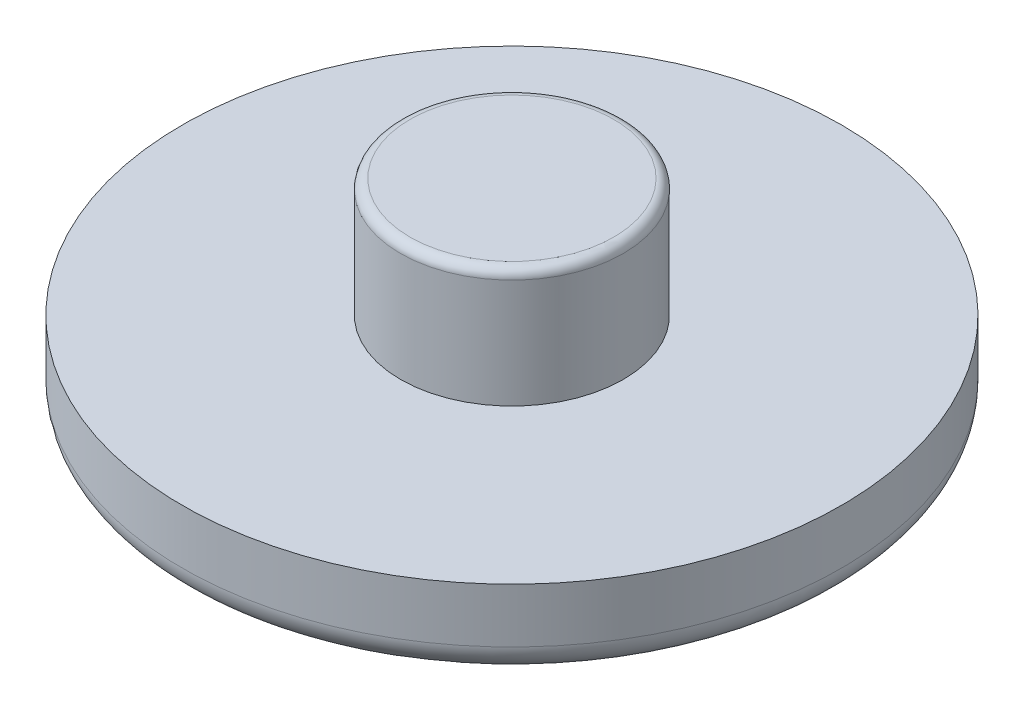
ISO-10303-21;
HEADER;
FILE_DESCRIPTION(('STEP AP214'),'2;1');
FILE_NAME('part.step','',(''),(''),'','','');
FILE_SCHEMA(('AUTOMOTIVE_DESIGN { 1 0 10303 214 1 1 1 1 }'));
ENDSEC;
DATA;
#1=APPLICATION_CONTEXT('core data for automotive mechanical design processes');
#2=APPLICATION_PROTOCOL_DEFINITION('international standard','automotive_design',2000,#1);
#3=PRODUCT_CONTEXT('',#1,'mechanical');
#4=PRODUCT('Part','Part','',(#3));
#5=PRODUCT_RELATED_PRODUCT_CATEGORY('part','',(#4));
#6=PRODUCT_DEFINITION_FORMATION('','',#4);
#7=PRODUCT_DEFINITION_CONTEXT('part definition',#1,'design');
#8=PRODUCT_DEFINITION('design','',#6,#7);
#9=PRODUCT_DEFINITION_SHAPE('','',#8);
#10=(LENGTH_UNIT() NAMED_UNIT(*) SI_UNIT(.MILLI.,.METRE.));
#11=(NAMED_UNIT(*) PLANE_ANGLE_UNIT() SI_UNIT($,.RADIAN.));
#12=(NAMED_UNIT(*) SI_UNIT($,.STERADIAN.) SOLID_ANGLE_UNIT());
#13=UNCERTAINTY_MEASURE_WITH_UNIT(LENGTH_MEASURE(1.E-05),#10,'distance_accuracy_value','');
#14=(GEOMETRIC_REPRESENTATION_CONTEXT(3) GLOBAL_UNCERTAINTY_ASSIGNED_CONTEXT((#13)) GLOBAL_UNIT_ASSIGNED_CONTEXT((#10,
#11,#12)) REPRESENTATION_CONTEXT('',''));
#15=CARTESIAN_POINT('',(0.,0.,0.));
#16=DIRECTION('',(0.,0.,1.));
#17=DIRECTION('',(1.,0.,0.));
#18=AXIS2_PLACEMENT_3D('',#15,#16,#17);
#19=CARTESIAN_POINT('',(0.,7.62,0.));
#20=DIRECTION('',(0.,-1.,0.));
#21=DIRECTION('',(0.,0.,-1.));
#22=AXIS2_PLACEMENT_3D('',#19,#20,#21);
#23=CYLINDRICAL_SURFACE('',#22,17.653);
#24=CARTESIAN_POINT('',(0.,4.70681863089363,0.));
#25=DIRECTION('',(0.,-1.,0.));
#26=DIRECTION('',(0.,0.,-1.));
#27=AXIS2_PLACEMENT_3D('',#24,#25,#26);
#28=CIRCLE('',#27,17.653);
#29=CARTESIAN_POINT('',(0.,4.70681863089363,-17.653));
#30=VERTEX_POINT('',#29);
#31=EDGE_CURVE('E44',#30,#30,#28,.F.);
#32=CARTESIAN_POINT('',(0.,7.62,0.));
#33=DIRECTION('',(0.,1.,0.));
#34=DIRECTION('',(0.,0.,1.));
#35=AXIS2_PLACEMENT_3D('',#32,#33,#34);
#36=CIRCLE('',#35,17.653);
#37=CARTESIAN_POINT('',(0.,7.62,-17.653));
#38=VERTEX_POINT('',#37);
#39=EDGE_CURVE('E60',#38,#38,#36,.T.);
#40=CARTESIAN_POINT('',(0.,4.70681863089363,-17.653));
#41=CARTESIAN_POINT('',(0.,4.73716427015516,-17.653));
#42=CARTESIAN_POINT('',(0.,4.76750990941668,-17.653));
#43=CARTESIAN_POINT('',(0.,4.82820118793973,-17.653));
#44=CARTESIAN_POINT('',(0.,4.85854682720125,-17.653));
#45=CARTESIAN_POINT('',(0.,4.9192381057243,-17.653));
#46=CARTESIAN_POINT('',(0.,4.94958374498583,-17.653));
#47=CARTESIAN_POINT('',(0.,5.01027502350888,-17.653));
#48=CARTESIAN_POINT('',(0.,5.0406206627704,-17.653));
#49=CARTESIAN_POINT('',(0.,5.10131194129345,-17.653));
#50=CARTESIAN_POINT('',(0.,5.13165758055498,-17.653));
#51=CARTESIAN_POINT('',(0.,5.19234885907803,-17.653));
#52=CARTESIAN_POINT('',(0.,5.22269449833955,-17.653));
#53=CARTESIAN_POINT('',(0.,5.2833857768626,-17.653));
#54=CARTESIAN_POINT('',(0.,5.31373141612412,-17.653));
#55=CARTESIAN_POINT('',(0.,5.37442269464717,-17.653));
#56=CARTESIAN_POINT('',(0.,5.4047683339087,-17.653));
#57=CARTESIAN_POINT('',(0.,5.46545961243175,-17.653));
#58=CARTESIAN_POINT('',(0.,5.49580525169327,-17.653));
#59=CARTESIAN_POINT('',(0.,5.55649653021632,-17.653));
#60=CARTESIAN_POINT('',(0.,5.58684216947785,-17.653));
#61=CARTESIAN_POINT('',(0.,5.6475334480009,-17.653));
#62=CARTESIAN_POINT('',(0.,5.67787908726242,-17.653));
#63=CARTESIAN_POINT('',(0.,5.73857036578547,-17.653));
#64=CARTESIAN_POINT('',(0.,5.76891600504699,-17.653));
#65=CARTESIAN_POINT('',(0.,5.82960728357004,-17.653));
#66=CARTESIAN_POINT('',(0.,5.85995292283157,-17.653));
#67=CARTESIAN_POINT('',(0.,5.92064420135462,-17.653));
#68=CARTESIAN_POINT('',(0.,5.95098984061614,-17.653));
#69=CARTESIAN_POINT('',(0.,6.01168111913919,-17.653));
#70=CARTESIAN_POINT('',(0.,6.04202675840072,-17.653));
#71=CARTESIAN_POINT('',(0.,6.10271803692377,-17.653));
#72=CARTESIAN_POINT('',(0.,6.13306367618529,-17.653));
#73=CARTESIAN_POINT('',(0.,6.19375495470834,-17.653));
#74=CARTESIAN_POINT('',(0.,6.22410059396986,-17.653));
#75=CARTESIAN_POINT('',(0.,6.28479187249291,-17.653));
#76=CARTESIAN_POINT('',(0.,6.31513751175444,-17.653));
#77=CARTESIAN_POINT('',(0.,6.37582879027749,-17.653));
#78=CARTESIAN_POINT('',(0.,6.40617442953901,-17.653));
#79=CARTESIAN_POINT('',(0.,6.46686570806206,-17.653));
#80=CARTESIAN_POINT('',(0.,6.49721134732359,-17.653));
#81=CARTESIAN_POINT('',(0.,6.55790262584664,-17.653));
#82=CARTESIAN_POINT('',(0.,6.58824826510816,-17.653));
#83=CARTESIAN_POINT('',(0.,6.64893954363121,-17.653));
#84=CARTESIAN_POINT('',(0.,6.67928518289273,-17.653));
#85=CARTESIAN_POINT('',(0.,6.73997646141578,-17.653));
#86=CARTESIAN_POINT('',(0.,6.77032210067731,-17.653));
#87=CARTESIAN_POINT('',(0.,6.83101337920036,-17.653));
#88=CARTESIAN_POINT('',(0.,6.86135901846188,-17.653));
#89=CARTESIAN_POINT('',(0.,6.92205029698493,-17.653));
#90=CARTESIAN_POINT('',(0.,6.95239593624646,-17.653));
#91=CARTESIAN_POINT('',(0.,7.01308721476951,-17.653));
#92=CARTESIAN_POINT('',(0.,7.04343285403103,-17.653));
#93=CARTESIAN_POINT('',(0.,7.10412413255408,-17.653));
#94=CARTESIAN_POINT('',(0.,7.1344697718156,-17.653));
#95=CARTESIAN_POINT('',(0.,7.19516105033865,-17.653));
#96=CARTESIAN_POINT('',(0.,7.22550668960018,-17.653));
#97=CARTESIAN_POINT('',(0.,7.28619796812323,-17.653));
#98=CARTESIAN_POINT('',(0.,7.31654360738475,-17.653));
#99=CARTESIAN_POINT('',(0.,7.3772348859078,-17.653));
#100=CARTESIAN_POINT('',(0.,7.40758052516933,-17.653));
#101=CARTESIAN_POINT('',(0.,7.46827180369238,-17.653));
#102=CARTESIAN_POINT('',(0.,7.4986174429539,-17.653));
#103=CARTESIAN_POINT('',(0.,7.55930872147695,-17.653));
#104=CARTESIAN_POINT('',(0.,7.58965436073847,-17.653));
#105=CARTESIAN_POINT('',(0.,7.62,-17.653));
#106=B_SPLINE_CURVE_WITH_KNOTS('',3,(#40,#41,#42,#43,#44,#45,#46,#47,#48,#49,#50,#51,#52,#53,
#54,#55,#56,#57,#58,#59,#60,#61,#62,#63,#64,#65,#66,#67,#68,#69,#70,#71,#72,#73,#74,#75,#76,#77,
#78,#79,#80,#81,#82,#83,#84,#85,#86,#87,#88,#89,#90,#91,#92,#93,#94,#95,#96,#97,#98,#99,#100,
#101,#102,#103,#104,#105),.UNSPECIFIED.,.F.,.F.,(4,2,2,2,2,2,2,2,2,2,2,2,2,2,2,2,2,2,2,2,2,2,2,
2,2,2,2,2,2,2,2,2,4),(0.,0.091036917784575,0.182073835569148,0.273110753353722,
0.364147671138296,0.455184588922871,0.546221506707445,0.637258424492018,0.728295342276593,
0.819332260061166,0.910369177845741,1.00140609563031,1.09244301341489,1.18347993119946,
1.27451684898404,1.36555376676861,1.45659068455318,1.54762760233776,1.63866452012233,
1.72970143790691,1.82073835569148,1.91177527347605,2.00281219126063,2.0938491090452,
2.18488602682978,2.27592294461435,2.36695986239892,2.4579967801835,2.54903369796807,
2.64007061575265,2.73110753353722,2.82214445132179,2.91318136910637),.UNSPECIFIED.);
#107=EDGE_CURVE('BSEAM33',#30,#38,#106,.T.);
#108=ORIENTED_EDGE('',*,*,#31,.T.);
#109=ORIENTED_EDGE('',*,*,#39,.F.);
#110=ORIENTED_EDGE('',*,*,#107,.T.);
#111=ORIENTED_EDGE('',*,*,#107,.F.);
#112=EDGE_LOOP('',(#108,#110,#109,#111));
#113=FACE_BOUND('',#112,.T.);
#114=ADVANCED_FACE('F33',(#113),#23,.T.);
#115=CARTESIAN_POINT('',(0.,7.62,0.));
#116=DIRECTION('',(0.,1.,0.));
#117=DIRECTION('',(0.,0.,1.));
#118=AXIS2_PLACEMENT_3D('',#115,#116,#117);
#119=PLANE('',#118);
#120=CARTESIAN_POINT('',(0.,7.62,0.));
#121=DIRECTION('',(0.,1.,0.));
#122=DIRECTION('',(0.,0.,1.));
#123=AXIS2_PLACEMENT_3D('',#120,#121,#122);
#124=CIRCLE('',#123,5.969);
#125=CARTESIAN_POINT('',(0.,7.62,5.969));
#126=VERTEX_POINT('',#125);
#127=EDGE_CURVE('E59',#126,#126,#124,.T.);
#128=ORIENTED_EDGE('',*,*,#127,.F.);
#129=EDGE_LOOP('',(#128));
#130=FACE_BOUND('',#129,.T.);
#131=ORIENTED_EDGE('',*,*,#39,.T.);
#132=EDGE_LOOP('',(#131));
#133=FACE_BOUND('',#132,.T.);
#134=ADVANCED_FACE('F68',(#130,#133),#119,.T.);
#135=CARTESIAN_POINT('',(0.,0.,0.));
#136=DIRECTION('',(0.,1.,0.));
#137=DIRECTION('',(0.,0.,1.));
#138=AXIS2_PLACEMENT_3D('',#135,#136,#137);
#139=PLANE('',#138);
#140=CARTESIAN_POINT('',(0.,0.,0.));
#141=DIRECTION('',(0.,1.,0.));
#142=DIRECTION('',(0.,0.,1.));
#143=AXIS2_PLACEMENT_3D('',#140,#141,#142);
#144=CIRCLE('',#143,7.3842776814002);
#145=CARTESIAN_POINT('',(0.,0.,7.3842776814002));
#146=VERTEX_POINT('',#145);
#147=EDGE_CURVE('E56',#146,#146,#144,.F.);
#148=ORIENTED_EDGE('',*,*,#147,.T.);
#149=EDGE_LOOP('',(#148));
#150=FACE_BOUND('',#149,.T.);
#151=ADVANCED_FACE('F71',(#150),#139,.F.);
#152=CARTESIAN_POINT('',(0.,13.97,0.));
#153=DIRECTION('',(0.,-1.,0.));
#154=DIRECTION('',(0.,0.,-1.));
#155=AXIS2_PLACEMENT_3D('',#152,#153,#154);
#156=CYLINDRICAL_SURFACE('',#155,5.969);
#157=CARTESIAN_POINT('',(0.,13.462,0.));
#158=DIRECTION('',(0.,1.,0.));
#159=DIRECTION('',(0.,0.,1.));
#160=AXIS2_PLACEMENT_3D('',#157,#158,#159);
#161=CIRCLE('',#160,5.969);
#162=CARTESIAN_POINT('',(0.,13.462,5.969));
#163=VERTEX_POINT('',#162);
#164=EDGE_CURVE('E10',#163,#163,#161,.F.);
#165=ORIENTED_EDGE('',*,*,#164,.T.);
#166=EDGE_LOOP('',(#165));
#167=FACE_BOUND('',#166,.T.);
#168=ORIENTED_EDGE('',*,*,#127,.T.);
#169=EDGE_LOOP('',(#168));
#170=FACE_BOUND('',#169,.T.);
#171=ADVANCED_FACE('F66',(#167,#170),#156,.T.);
#172=CARTESIAN_POINT('',(0.,13.97,0.));
#173=DIRECTION('',(0.,1.,0.));
#174=DIRECTION('',(0.,0.,1.));
#175=AXIS2_PLACEMENT_3D('',#172,#173,#174);
#176=PLANE('',#175);
#177=CARTESIAN_POINT('',(0.,13.97,0.));
#178=DIRECTION('',(0.,1.,0.));
#179=DIRECTION('',(0.,0.,1.));
#180=AXIS2_PLACEMENT_3D('',#177,#178,#179);
#181=CIRCLE('',#180,5.461);
#182=CARTESIAN_POINT('',(0.,13.97,5.461));
#183=VERTEX_POINT('',#182);
#184=EDGE_CURVE('E40',#183,#183,#181,.T.);
#185=ORIENTED_EDGE('',*,*,#184,.T.);
#186=EDGE_LOOP('',(#185));
#187=FACE_BOUND('',#186,.T.);
#188=ADVANCED_FACE('F86',(#187),#176,.T.);
#189=CARTESIAN_POINT('',(0.,3.63970234266203,0.));
#190=DIRECTION('',(0.,1.,0.));
#191=DIRECTION('',(0.,0.,1.));
#192=AXIS2_PLACEMENT_3D('',#189,#190,#191);
#193=CONICAL_SURFACE('',#192,17.653,1.22173047639603);
#194=CARTESIAN_POINT('',(0.,0.0919084459222695,0.));
#195=DIRECTION('',(0.,1.,0.));
#196=DIRECTION('',(0.,0.,1.));
#197=AXIS2_PLACEMENT_3D('',#194,#195,#196);
#198=CIRCLE('',#197,7.90551637982852);
#199=CARTESIAN_POINT('',(0.,0.0919084459222695,7.90551637982852));
#200=VERTEX_POINT('',#199);
#201=EDGE_CURVE('E48',#200,#200,#198,.T.);
#202=ORIENTED_EDGE('',*,*,#201,.T.);
#203=EDGE_LOOP('',(#202));
#204=FACE_BOUND('',#203,.T.);
#205=CARTESIAN_POINT('',(0.,3.2747270768159,0.));
#206=DIRECTION('',(0.,1.,0.));
#207=DIRECTION('',(0.,0.,1.));
#208=AXIS2_PLACEMENT_3D('',#205,#206,#207);
#209=CIRCLE('',#208,16.6502386984283);
#210=CARTESIAN_POINT('',(0.,3.2747270768159,16.6502386984283));
#211=VERTEX_POINT('',#210);
#212=EDGE_CURVE('E53',#211,#211,#209,.F.);
#213=ORIENTED_EDGE('',*,*,#212,.T.);
#214=EDGE_LOOP('',(#213));
#215=FACE_BOUND('',#214,.T.);
#216=ADVANCED_FACE('F82',(#204,#215),#193,.T.);
#217=CARTESIAN_POINT('',(0.,1.524,0.));
#218=DIRECTION('',(0.,1.,0.));
#219=DIRECTION('',(0.,0.,1.));
#220=AXIS2_PLACEMENT_3D('',#217,#218,#219);
#221=TOROIDAL_SURFACE('',#220,7.3842776814002,1.524);
#222=ORIENTED_EDGE('',*,*,#201,.F.);
#223=EDGE_LOOP('',(#222));
#224=FACE_BOUND('',#223,.T.);
#225=ORIENTED_EDGE('',*,*,#147,.F.);
#226=EDGE_LOOP('',(#225));
#227=FACE_BOUND('',#226,.T.);
#228=ADVANCED_FACE('F85',(#224,#227),#221,.T.);
#229=CARTESIAN_POINT('',(0.,4.70681863089363,0.));
#230=DIRECTION('',(0.,-1.,0.));
#231=DIRECTION('',(0.,0.,-1.));
#232=AXIS2_PLACEMENT_3D('',#229,#230,#231);
#233=TOROIDAL_SURFACE('',#232,16.129,1.524);
#234=ORIENTED_EDGE('',*,*,#212,.F.);
#235=EDGE_LOOP('',(#234));
#236=FACE_BOUND('',#235,.T.);
#237=ORIENTED_EDGE('',*,*,#31,.F.);
#238=EDGE_LOOP('',(#237));
#239=FACE_BOUND('',#238,.T.);
#240=ADVANCED_FACE('F89',(#236,#239),#233,.T.);
#241=CARTESIAN_POINT('',(0.,13.462,0.));
#242=DIRECTION('',(0.,1.,0.));
#243=DIRECTION('',(0.,0.,1.));
#244=AXIS2_PLACEMENT_3D('',#241,#242,#243);
#245=TOROIDAL_SURFACE('',#244,5.461,0.508);
#246=ORIENTED_EDGE('',*,*,#164,.F.);
#247=EDGE_LOOP('',(#246));
#248=FACE_BOUND('',#247,.T.);
#249=ORIENTED_EDGE('',*,*,#184,.F.);
#250=EDGE_LOOP('',(#249));
#251=FACE_BOUND('',#250,.T.);
#252=ADVANCED_FACE('F35',(#248,#251),#245,.T.);
#253=CLOSED_SHELL('',(#114,#134,#151,#171,#188,#216,#228,#240,#252));
#254=MANIFOLD_SOLID_BREP('B2',#253);
#255=ADVANCED_BREP_SHAPE_REPRESENTATION('',(#18,#254),#14);
#256=SHAPE_DEFINITION_REPRESENTATION(#9,#255);
ENDSEC;
END-ISO-10303-21;
